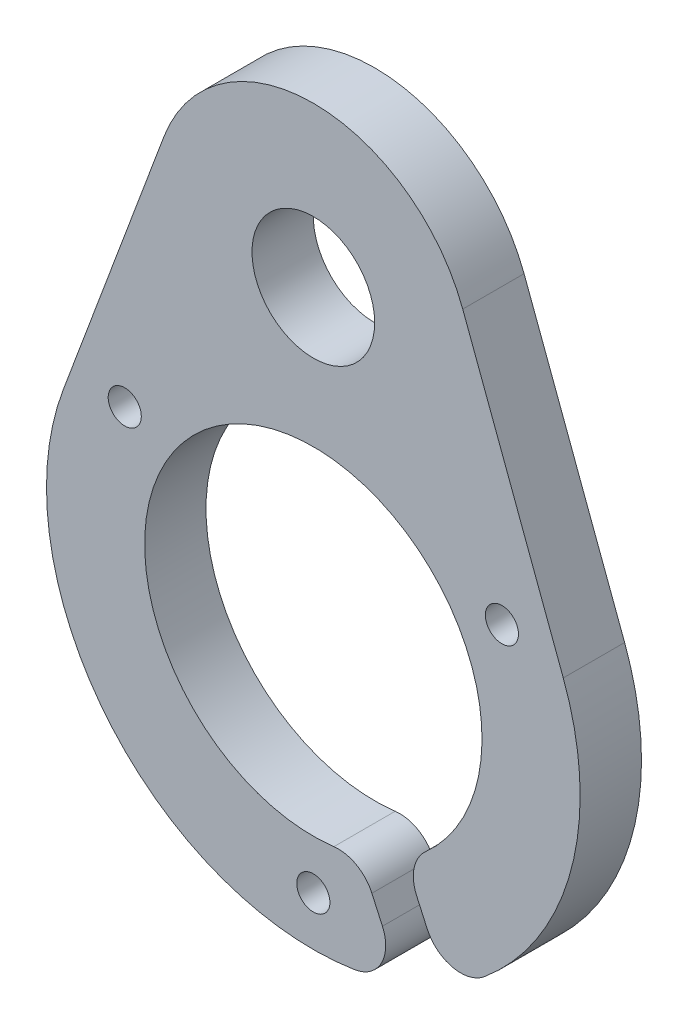
ISO-10303-21;
HEADER;
FILE_DESCRIPTION(('STEP AP214'),'2;1');
FILE_NAME('part.step','',(''),(''),'','','');
FILE_SCHEMA(('AUTOMOTIVE_DESIGN { 1 0 10303 214 1 1 1 1 }'));
ENDSEC;
DATA;
#1=APPLICATION_CONTEXT('core data for automotive mechanical design processes');
#2=APPLICATION_PROTOCOL_DEFINITION('international standard','automotive_design',2000,#1);
#3=PRODUCT_CONTEXT('',#1,'mechanical');
#4=PRODUCT('Part','Part','',(#3));
#5=PRODUCT_RELATED_PRODUCT_CATEGORY('part','',(#4));
#6=PRODUCT_DEFINITION_FORMATION('','',#4);
#7=PRODUCT_DEFINITION_CONTEXT('part definition',#1,'design');
#8=PRODUCT_DEFINITION('design','',#6,#7);
#9=PRODUCT_DEFINITION_SHAPE('','',#8);
#10=(LENGTH_UNIT() NAMED_UNIT(*) SI_UNIT(.MILLI.,.METRE.));
#11=(NAMED_UNIT(*) PLANE_ANGLE_UNIT() SI_UNIT($,.RADIAN.));
#12=(NAMED_UNIT(*) SI_UNIT($,.STERADIAN.) SOLID_ANGLE_UNIT());
#13=UNCERTAINTY_MEASURE_WITH_UNIT(LENGTH_MEASURE(1.E-05),#10,'distance_accuracy_value','');
#14=(GEOMETRIC_REPRESENTATION_CONTEXT(3) GLOBAL_UNCERTAINTY_ASSIGNED_CONTEXT((#13)) GLOBAL_UNIT_ASSIGNED_CONTEXT((#10,
#11,#12)) REPRESENTATION_CONTEXT('',''));
#15=CARTESIAN_POINT('',(0.,0.,0.));
#16=DIRECTION('',(0.,0.,1.));
#17=DIRECTION('',(1.,0.,0.));
#18=AXIS2_PLACEMENT_3D('',#15,#16,#17);
#19=CARTESIAN_POINT('',(0.,0.,5.));
#20=DIRECTION('',(0.,0.,-1.));
#21=DIRECTION('',(-1.,0.,0.));
#22=AXIS2_PLACEMENT_3D('',#19,#20,#21);
#23=PLANE('',#22);
#24=DIRECTION('',(0.412539939152384,-0.910939514240186,0.));
#25=VECTOR('',#24,1.);
#26=CARTESIAN_POINT('',(7.43397659385823,-11.5671298082959,5.));
#27=LINE('',#26,#25);
#28=CARTESIAN_POINT('',(8.41687544862555,-13.7374927727852,5.));
#29=VERTEX_POINT('',#28);
#30=CARTESIAN_POINT('',(9.27690492252214,-15.6365448567925,5.));
#31=VERTEX_POINT('',#30);
#32=EDGE_CURVE('E135',#29,#31,#27,.T.);
#33=ORIENTED_EDGE('',*,*,#32,.T.);
#34=CARTESIAN_POINT('',(12.0097234652427,-14.3989250393354,5.));
#35=DIRECTION('',(0.,0.,-1.));
#36=DIRECTION('',(-1.,0.,0.));
#37=AXIS2_PLACEMENT_3D('',#34,#35,#36);
#38=CIRCLE('',#37,3.);
#39=CARTESIAN_POINT('',(13.9312792196815,-16.702753045629,5.));
#40=VERTEX_POINT('',#39);
#41=EDGE_CURVE('E131',#31,#40,#38,.F.);
#42=ORIENTED_EDGE('',*,*,#41,.T.);
#43=CARTESIAN_POINT('',(0.,0.,5.));
#44=DIRECTION('',(0.,0.,1.));
#45=DIRECTION('',(1.,0.,0.));
#46=AXIS2_PLACEMENT_3D('',#43,#44,#45);
#47=CIRCLE('',#46,21.75);
#48=CARTESIAN_POINT('',(20.3743059697748,7.6125,5.));
#49=VERTEX_POINT('',#48);
#50=EDGE_CURVE('E123',#40,#49,#47,.T.);
#51=ORIENTED_EDGE('',*,*,#50,.T.);
#52=DIRECTION('',(-0.35,0.93674969975976,0.));
#53=VECTOR('',#52,1.);
#54=CARTESIAN_POINT('',(12.1777460968769,29.55,5.));
#55=LINE('',#54,#53);
#56=CARTESIAN_POINT('',(12.1777460968769,29.55,5.));
#57=VERTEX_POINT('',#56);
#58=EDGE_CURVE('E128',#49,#57,#55,.T.);
#59=ORIENTED_EDGE('',*,*,#58,.T.);
#60=CARTESIAN_POINT('',(0.,25.,5.));
#61=DIRECTION('',(0.,0.,1.));
#62=DIRECTION('',(-1.,0.,0.));
#63=AXIS2_PLACEMENT_3D('',#60,#61,#62);
#64=CIRCLE('',#63,13.);
#65=CARTESIAN_POINT('',(-12.1777460968769,29.55,5.));
#66=VERTEX_POINT('',#65);
#67=EDGE_CURVE('E150',#57,#66,#64,.T.);
#68=ORIENTED_EDGE('',*,*,#67,.T.);
#69=DIRECTION('',(-0.35,-0.93674969975976,0.));
#70=VECTOR('',#69,1.);
#71=CARTESIAN_POINT('',(-20.3743059697748,7.6125,5.));
#72=LINE('',#71,#70);
#73=CARTESIAN_POINT('',(-20.3743059697747,7.61249999999996,5.));
#74=VERTEX_POINT('',#73);
#75=EDGE_CURVE('E152',#66,#74,#72,.T.);
#76=ORIENTED_EDGE('',*,*,#75,.T.);
#77=CARTESIAN_POINT('',(2.0122792321331E-13,0.,5.));
#78=DIRECTION('',(0.,0.,1.));
#79=DIRECTION('',(1.,0.,0.));
#80=AXIS2_PLACEMENT_3D('',#77,#78,#79);
#81=CIRCLE('',#80,21.7500000000001);
#82=CARTESIAN_POINT('',(3.36438085449537,-21.4882163397968,5.));
#83=VERTEX_POINT('',#82);
#84=EDGE_CURVE('E157',#74,#83,#81,.T.);
#85=ORIENTED_EDGE('',*,*,#84,.T.);
#86=CARTESIAN_POINT('',(2.90032832284087,-18.5243244308593,5.));
#87=DIRECTION('',(0.,0.,-1.));
#88=DIRECTION('',(-1.,0.,0.));
#89=AXIS2_PLACEMENT_3D('',#86,#87,#88);
#90=CIRCLE('',#89,3.);
#91=CARTESIAN_POINT('',(5.63314686556143,-17.2867046134021,5.));
#92=VERTEX_POINT('',#91);
#93=EDGE_CURVE('E57',#83,#92,#90,.F.);
#94=ORIENTED_EDGE('',*,*,#93,.T.);
#95=DIRECTION('',(-0.412539939152385,0.910939514240186,0.));
#96=VECTOR('',#95,1.);
#97=CARTESIAN_POINT('',(3.79021853689748,-13.2172895649055,5.));
#98=LINE('',#97,#96);
#99=CARTESIAN_POINT('',(4.7731173916648,-15.3876525293947,5.));
#100=VERTEX_POINT('',#99);
#101=EDGE_CURVE('E159',#92,#100,#98,.T.);
#102=ORIENTED_EDGE('',*,*,#101,.T.);
#103=CARTESIAN_POINT('',(2.04029884894424,-16.6252723468519,5.));
#104=DIRECTION('',(0.,0.,-1.));
#105=DIRECTION('',(-1.,0.,0.));
#106=AXIS2_PLACEMENT_3D('',#103,#104,#105);
#107=CIRCLE('',#106,3.);
#108=CARTESIAN_POINT('',(1.67487218943184,-13.6476116280127,5.));
#109=VERTEX_POINT('',#108);
#110=EDGE_CURVE('E205',#100,#109,#107,.F.);
#111=ORIENTED_EDGE('',*,*,#110,.T.);
#112=CARTESIAN_POINT('',(0.,0.,5.));
#113=DIRECTION('',(0.,0.,-1.));
#114=DIRECTION('',(-1.,0.,0.));
#115=AXIS2_PLACEMENT_3D('',#112,#113,#114);
#116=CIRCLE('',#115,13.75);
#117=CARTESIAN_POINT('',(9.15273387349307,-10.2610897394484,5.));
#118=VERTEX_POINT('',#117);
#119=EDGE_CURVE('E181',#109,#118,#116,.T.);
#120=ORIENTED_EDGE('',*,*,#119,.T.);
#121=CARTESIAN_POINT('',(11.1496939913461,-12.499872955328,5.));
#122=DIRECTION('',(0.,0.,-1.));
#123=DIRECTION('',(-1.,0.,0.));
#124=AXIS2_PLACEMENT_3D('',#121,#122,#123);
#125=CIRCLE('',#124,3.);
#126=EDGE_CURVE('E203',#118,#29,#125,.F.);
#127=ORIENTED_EDGE('',*,*,#126,.T.);
#128=EDGE_LOOP('',(#33,#42,#51,#59,#68,#76,#85,#94,#102,#111,#120,#127));
#129=FACE_BOUND('',#128,.T.);
#130=CARTESIAN_POINT('',(0.,25.,5.));
#131=DIRECTION('',(0.,0.,1.));
#132=DIRECTION('',(1.,0.,0.));
#133=AXIS2_PLACEMENT_3D('',#130,#131,#132);
#134=CIRCLE('',#133,5.);
#135=CARTESIAN_POINT('',(5.,25.,5.));
#136=VERTEX_POINT('',#135);
#137=EDGE_CURVE('E166',#136,#136,#134,.T.);
#138=ORIENTED_EDGE('',*,*,#137,.F.);
#139=EDGE_LOOP('',(#138));
#140=FACE_BOUND('',#139,.T.);
#141=CARTESIAN_POINT('',(0.,-17.75,5.));
#142=DIRECTION('',(0.,0.,1.));
#143=DIRECTION('',(1.,0.,0.));
#144=AXIS2_PLACEMENT_3D('',#141,#142,#143);
#145=CIRCLE('',#144,1.35);
#146=CARTESIAN_POINT('',(1.35,-17.75,5.));
#147=VERTEX_POINT('',#146);
#148=EDGE_CURVE('E239',#147,#147,#145,.T.);
#149=ORIENTED_EDGE('',*,*,#148,.F.);
#150=EDGE_LOOP('',(#149));
#151=FACE_BOUND('',#150,.T.);
#152=CARTESIAN_POINT('',(15.3719509171737,8.87500000000007,5.));
#153=DIRECTION('',(0.,0.,1.));
#154=DIRECTION('',(1.,0.,0.));
#155=AXIS2_PLACEMENT_3D('',#152,#153,#154);
#156=CIRCLE('',#155,1.35);
#157=CARTESIAN_POINT('',(16.7219509171737,8.87500000000007,5.));
#158=VERTEX_POINT('',#157);
#159=EDGE_CURVE('E245',#158,#158,#156,.T.);
#160=ORIENTED_EDGE('',*,*,#159,.F.);
#161=EDGE_LOOP('',(#160));
#162=FACE_BOUND('',#161,.T.);
#163=CARTESIAN_POINT('',(-15.3719509171737,8.87500000000007,5.));
#164=DIRECTION('',(0.,0.,1.));
#165=DIRECTION('',(1.,0.,0.));
#166=AXIS2_PLACEMENT_3D('',#163,#164,#165);
#167=CIRCLE('',#166,1.35);
#168=CARTESIAN_POINT('',(-14.0219509171737,8.87500000000007,5.));
#169=VERTEX_POINT('',#168);
#170=EDGE_CURVE('E251',#169,#169,#167,.T.);
#171=ORIENTED_EDGE('',*,*,#170,.F.);
#172=EDGE_LOOP('',(#171));
#173=FACE_BOUND('',#172,.T.);
#174=ADVANCED_FACE('F36',(#129,#140,#151,#162,#173),#23,.F.);
#175=CARTESIAN_POINT('',(0.,0.,0.));
#176=DIRECTION('',(0.,0.,-1.));
#177=DIRECTION('',(-1.,0.,0.));
#178=AXIS2_PLACEMENT_3D('',#175,#176,#177);
#179=PLANE('',#178);
#180=CARTESIAN_POINT('',(15.3719509171737,8.87500000000007,0.));
#181=DIRECTION('',(0.,0.,1.));
#182=DIRECTION('',(1.,0.,0.));
#183=AXIS2_PLACEMENT_3D('',#180,#181,#182);
#184=CIRCLE('',#183,1.35);
#185=CARTESIAN_POINT('',(16.7219509171737,8.87500000000007,0.));
#186=VERTEX_POINT('',#185);
#187=EDGE_CURVE('E248',#186,#186,#184,.T.);
#188=ORIENTED_EDGE('',*,*,#187,.T.);
#189=EDGE_LOOP('',(#188));
#190=FACE_BOUND('',#189,.T.);
#191=CARTESIAN_POINT('',(0.,25.,0.));
#192=DIRECTION('',(0.,0.,1.));
#193=DIRECTION('',(1.,0.,0.));
#194=AXIS2_PLACEMENT_3D('',#191,#192,#193);
#195=CIRCLE('',#194,5.);
#196=CARTESIAN_POINT('',(5.,25.,0.));
#197=VERTEX_POINT('',#196);
#198=EDGE_CURVE('E236',#197,#197,#195,.T.);
#199=ORIENTED_EDGE('',*,*,#198,.T.);
#200=EDGE_LOOP('',(#199));
#201=FACE_BOUND('',#200,.T.);
#202=CARTESIAN_POINT('',(0.,0.,0.));
#203=DIRECTION('',(0.,0.,1.));
#204=DIRECTION('',(1.,0.,0.));
#205=AXIS2_PLACEMENT_3D('',#202,#203,#204);
#206=CIRCLE('',#205,21.75);
#207=CARTESIAN_POINT('',(13.9312792196815,-16.702753045629,0.));
#208=VERTEX_POINT('',#207);
#209=CARTESIAN_POINT('',(20.3743059697748,7.6125,0.));
#210=VERTEX_POINT('',#209);
#211=EDGE_CURVE('E141',#208,#210,#206,.T.);
#212=ORIENTED_EDGE('',*,*,#211,.F.);
#213=CARTESIAN_POINT('',(12.0097234652427,-14.3989250393354,0.));
#214=DIRECTION('',(0.,0.,-1.));
#215=DIRECTION('',(-1.,0.,0.));
#216=AXIS2_PLACEMENT_3D('',#213,#214,#215);
#217=CIRCLE('',#216,3.);
#218=CARTESIAN_POINT('',(9.27690492252214,-15.6365448567925,0.));
#219=VERTEX_POINT('',#218);
#220=EDGE_CURVE('E195',#208,#219,#217,.T.);
#221=ORIENTED_EDGE('',*,*,#220,.T.);
#222=DIRECTION('',(0.412539939152384,-0.910939514240186,0.));
#223=VECTOR('',#222,1.);
#224=CARTESIAN_POINT('',(7.43397659385823,-11.5671298082959,0.));
#225=LINE('',#224,#223);
#226=CARTESIAN_POINT('',(8.41687544862555,-13.7374927727852,0.));
#227=VERTEX_POINT('',#226);
#228=EDGE_CURVE('E165',#227,#219,#225,.T.);
#229=ORIENTED_EDGE('',*,*,#228,.F.);
#230=CARTESIAN_POINT('',(11.1496939913461,-12.499872955328,0.));
#231=DIRECTION('',(0.,0.,-1.));
#232=DIRECTION('',(-1.,0.,0.));
#233=AXIS2_PLACEMENT_3D('',#230,#231,#232);
#234=CIRCLE('',#233,3.);
#235=CARTESIAN_POINT('',(9.15273387349307,-10.2610897394484,0.));
#236=VERTEX_POINT('',#235);
#237=EDGE_CURVE('E191',#227,#236,#234,.T.);
#238=ORIENTED_EDGE('',*,*,#237,.T.);
#239=CARTESIAN_POINT('',(0.,0.,0.));
#240=DIRECTION('',(0.,0.,-1.));
#241=DIRECTION('',(-1.,0.,0.));
#242=AXIS2_PLACEMENT_3D('',#239,#240,#241);
#243=CIRCLE('',#242,13.75);
#244=CARTESIAN_POINT('',(1.67487218943184,-13.6476116280127,0.));
#245=VERTEX_POINT('',#244);
#246=EDGE_CURVE('E162',#245,#236,#243,.T.);
#247=ORIENTED_EDGE('',*,*,#246,.F.);
#248=CARTESIAN_POINT('',(2.04029884894424,-16.6252723468519,0.));
#249=DIRECTION('',(0.,0.,-1.));
#250=DIRECTION('',(-1.,0.,0.));
#251=AXIS2_PLACEMENT_3D('',#248,#249,#250);
#252=CIRCLE('',#251,3.);
#253=CARTESIAN_POINT('',(4.7731173916648,-15.3876525293947,0.));
#254=VERTEX_POINT('',#253);
#255=EDGE_CURVE('E193',#245,#254,#252,.T.);
#256=ORIENTED_EDGE('',*,*,#255,.T.);
#257=DIRECTION('',(-0.412539939152385,0.910939514240186,0.));
#258=VECTOR('',#257,1.);
#259=CARTESIAN_POINT('',(3.79021853689748,-13.2172895649055,0.));
#260=LINE('',#259,#258);
#261=CARTESIAN_POINT('',(5.63314686556143,-17.2867046134021,0.));
#262=VERTEX_POINT('',#261);
#263=EDGE_CURVE('E179',#262,#254,#260,.T.);
#264=ORIENTED_EDGE('',*,*,#263,.F.);
#265=CARTESIAN_POINT('',(2.90032832284087,-18.5243244308593,0.));
#266=DIRECTION('',(0.,0.,-1.));
#267=DIRECTION('',(-1.,0.,0.));
#268=AXIS2_PLACEMENT_3D('',#265,#266,#267);
#269=CIRCLE('',#268,3.);
#270=CARTESIAN_POINT('',(3.36438085449537,-21.4882163397968,0.));
#271=VERTEX_POINT('',#270);
#272=EDGE_CURVE('E189',#262,#271,#269,.T.);
#273=ORIENTED_EDGE('',*,*,#272,.T.);
#274=CARTESIAN_POINT('',(2.0122792321331E-13,0.,0.));
#275=DIRECTION('',(0.,0.,1.));
#276=DIRECTION('',(1.,0.,0.));
#277=AXIS2_PLACEMENT_3D('',#274,#275,#276);
#278=CIRCLE('',#277,21.7500000000001);
#279=CARTESIAN_POINT('',(-20.3743059697747,7.61249999999996,0.));
#280=VERTEX_POINT('',#279);
#281=EDGE_CURVE('E176',#280,#271,#278,.T.);
#282=ORIENTED_EDGE('',*,*,#281,.F.);
#283=DIRECTION('',(-0.35,-0.93674969975976,0.));
#284=VECTOR('',#283,1.);
#285=CARTESIAN_POINT('',(-20.3743059697748,7.6125,0.));
#286=LINE('',#285,#284);
#287=CARTESIAN_POINT('',(-12.1777460968769,29.55,0.));
#288=VERTEX_POINT('',#287);
#289=EDGE_CURVE('E174',#288,#280,#286,.T.);
#290=ORIENTED_EDGE('',*,*,#289,.F.);
#291=CARTESIAN_POINT('',(0.,25.,0.));
#292=DIRECTION('',(0.,0.,1.));
#293=DIRECTION('',(-1.,0.,0.));
#294=AXIS2_PLACEMENT_3D('',#291,#292,#293);
#295=CIRCLE('',#294,13.);
#296=CARTESIAN_POINT('',(12.1777460968769,29.55,0.));
#297=VERTEX_POINT('',#296);
#298=EDGE_CURVE('E172',#297,#288,#295,.T.);
#299=ORIENTED_EDGE('',*,*,#298,.F.);
#300=DIRECTION('',(-0.35,0.93674969975976,0.));
#301=VECTOR('',#300,1.);
#302=CARTESIAN_POINT('',(12.1777460968769,29.55,0.));
#303=LINE('',#302,#301);
#304=EDGE_CURVE('E170',#210,#297,#303,.T.);
#305=ORIENTED_EDGE('',*,*,#304,.F.);
#306=EDGE_LOOP('',(#212,#221,#229,#238,#247,#256,#264,#273,#282,#290,#299,#305));
#307=FACE_BOUND('',#306,.T.);
#308=CARTESIAN_POINT('',(0.,-17.75,0.));
#309=DIRECTION('',(0.,0.,1.));
#310=DIRECTION('',(1.,0.,0.));
#311=AXIS2_PLACEMENT_3D('',#308,#309,#310);
#312=CIRCLE('',#311,1.35);
#313=CARTESIAN_POINT('',(1.35,-17.75,0.));
#314=VERTEX_POINT('',#313);
#315=EDGE_CURVE('E242',#314,#314,#312,.T.);
#316=ORIENTED_EDGE('',*,*,#315,.T.);
#317=EDGE_LOOP('',(#316));
#318=FACE_BOUND('',#317,.T.);
#319=CARTESIAN_POINT('',(-15.3719509171737,8.87500000000007,0.));
#320=DIRECTION('',(0.,0.,1.));
#321=DIRECTION('',(1.,0.,0.));
#322=AXIS2_PLACEMENT_3D('',#319,#320,#321);
#323=CIRCLE('',#322,1.35);
#324=CARTESIAN_POINT('',(-14.0219509171737,8.87500000000007,0.));
#325=VERTEX_POINT('',#324);
#326=EDGE_CURVE('E254',#325,#325,#323,.T.);
#327=ORIENTED_EDGE('',*,*,#326,.T.);
#328=EDGE_LOOP('',(#327));
#329=FACE_BOUND('',#328,.T.);
#330=ADVANCED_FACE('F220',(#190,#201,#307,#318,#329),#179,.T.);
#331=CARTESIAN_POINT('',(0.,0.,5.));
#332=DIRECTION('',(0.,0.,-1.));
#333=DIRECTION('',(-1.,0.,0.));
#334=AXIS2_PLACEMENT_3D('',#331,#332,#333);
#335=CYLINDRICAL_SURFACE('',#334,13.75);
#336=ORIENTED_EDGE('',*,*,#119,.F.);
#337=DIRECTION('',(0.,0.,-1.));
#338=VECTOR('',#337,1.);
#339=CARTESIAN_POINT('',(1.67487218943184,-13.6476116280127,5.));
#340=LINE('',#339,#338);
#341=EDGE_CURVE('E210',#109,#245,#340,.T.);
#342=ORIENTED_EDGE('',*,*,#341,.T.);
#343=ORIENTED_EDGE('',*,*,#246,.T.);
#344=DIRECTION('',(0.,0.,-1.));
#345=VECTOR('',#344,1.);
#346=CARTESIAN_POINT('',(9.15273387349307,-10.2610897394484,5.));
#347=LINE('',#346,#345);
#348=EDGE_CURVE('E208',#236,#118,#347,.F.);
#349=ORIENTED_EDGE('',*,*,#348,.T.);
#350=EDGE_LOOP('',(#336,#342,#343,#349));
#351=FACE_BOUND('',#350,.T.);
#352=ADVANCED_FACE('F230',(#351),#335,.F.);
#353=CARTESIAN_POINT('',(7.43397659385823,-11.5671298082959,5.));
#354=DIRECTION('',(0.910939514240187,0.412539939152384,0.));
#355=DIRECTION('',(-0.412539939152384,0.910939514240187,0.));
#356=AXIS2_PLACEMENT_3D('',#353,#354,#355);
#357=PLANE('',#356);
#358=ORIENTED_EDGE('',*,*,#228,.T.);
#359=DIRECTION('',(0.,0.,-1.));
#360=VECTOR('',#359,1.);
#361=CARTESIAN_POINT('',(9.27690492252214,-15.6365448567925,5.));
#362=LINE('',#361,#360);
#363=EDGE_CURVE('E200',#219,#31,#362,.F.);
#364=ORIENTED_EDGE('',*,*,#363,.T.);
#365=ORIENTED_EDGE('',*,*,#32,.F.);
#366=DIRECTION('',(0.,0.,-1.));
#367=VECTOR('',#366,1.);
#368=CARTESIAN_POINT('',(8.41687544862555,-13.7374927727852,5.));
#369=LINE('',#368,#367);
#370=EDGE_CURVE('E197',#29,#227,#369,.T.);
#371=ORIENTED_EDGE('',*,*,#370,.T.);
#372=EDGE_LOOP('',(#358,#364,#365,#371));
#373=FACE_BOUND('',#372,.T.);
#374=ADVANCED_FACE('F292',(#373),#357,.F.);
#375=CARTESIAN_POINT('',(0.,0.,5.));
#376=DIRECTION('',(0.,0.,-1.));
#377=DIRECTION('',(-1.,0.,0.));
#378=AXIS2_PLACEMENT_3D('',#375,#376,#377);
#379=CYLINDRICAL_SURFACE('',#378,21.75);
#380=ORIENTED_EDGE('',*,*,#50,.F.);
#381=DIRECTION('',(0.,0.,-1.));
#382=VECTOR('',#381,1.);
#383=CARTESIAN_POINT('',(13.9312792196815,-16.702753045629,5.));
#384=LINE('',#383,#382);
#385=EDGE_CURVE('E144',#40,#208,#384,.T.);
#386=ORIENTED_EDGE('',*,*,#385,.T.);
#387=ORIENTED_EDGE('',*,*,#211,.T.);
#388=DIRECTION('',(0.,0.,-1.));
#389=VECTOR('',#388,1.);
#390=CARTESIAN_POINT('',(20.3743059697748,7.6125,5.));
#391=LINE('',#390,#389);
#392=EDGE_CURVE('E138',#49,#210,#391,.T.);
#393=ORIENTED_EDGE('',*,*,#392,.F.);
#394=EDGE_LOOP('',(#380,#386,#387,#393));
#395=FACE_BOUND('',#394,.T.);
#396=ADVANCED_FACE('F139',(#395),#379,.T.);
#397=CARTESIAN_POINT('',(12.1777460968769,29.55,5.));
#398=DIRECTION('',(-0.93674969975976,-0.35,0.));
#399=DIRECTION('',(0.35,-0.93674969975976,0.));
#400=AXIS2_PLACEMENT_3D('',#397,#398,#399);
#401=PLANE('',#400);
#402=ORIENTED_EDGE('',*,*,#304,.T.);
#403=DIRECTION('',(0.,0.,-1.));
#404=VECTOR('',#403,1.);
#405=CARTESIAN_POINT('',(12.1777460968769,29.55,5.));
#406=LINE('',#405,#404);
#407=EDGE_CURVE('E145',#57,#297,#406,.T.);
#408=ORIENTED_EDGE('',*,*,#407,.F.);
#409=ORIENTED_EDGE('',*,*,#58,.F.);
#410=ORIENTED_EDGE('',*,*,#392,.T.);
#411=EDGE_LOOP('',(#402,#408,#409,#410));
#412=FACE_BOUND('',#411,.T.);
#413=ADVANCED_FACE('F147',(#412),#401,.F.);
#414=CARTESIAN_POINT('',(0.,25.,5.));
#415=DIRECTION('',(0.,0.,-1.));
#416=DIRECTION('',(-1.,0.,0.));
#417=AXIS2_PLACEMENT_3D('',#414,#415,#416);
#418=CYLINDRICAL_SURFACE('',#417,13.);
#419=ORIENTED_EDGE('',*,*,#298,.T.);
#420=DIRECTION('',(0.,0.,-1.));
#421=VECTOR('',#420,1.);
#422=CARTESIAN_POINT('',(-12.1777460968769,29.55,5.));
#423=LINE('',#422,#421);
#424=EDGE_CURVE('E184',#66,#288,#423,.T.);
#425=ORIENTED_EDGE('',*,*,#424,.F.);
#426=ORIENTED_EDGE('',*,*,#67,.F.);
#427=ORIENTED_EDGE('',*,*,#407,.T.);
#428=EDGE_LOOP('',(#419,#425,#426,#427));
#429=FACE_BOUND('',#428,.T.);
#430=ADVANCED_FACE('F283',(#429),#418,.T.);
#431=CARTESIAN_POINT('',(-20.3743059697748,7.6125,5.));
#432=DIRECTION('',(0.93674969975976,-0.35,0.));
#433=DIRECTION('',(0.35,0.93674969975976,0.));
#434=AXIS2_PLACEMENT_3D('',#431,#432,#433);
#435=PLANE('',#434);
#436=ORIENTED_EDGE('',*,*,#289,.T.);
#437=DIRECTION('',(0.,0.,-1.));
#438=VECTOR('',#437,1.);
#439=CARTESIAN_POINT('',(-20.3743059697747,7.61249999999996,5.));
#440=LINE('',#439,#438);
#441=EDGE_CURVE('E161',#74,#280,#440,.T.);
#442=ORIENTED_EDGE('',*,*,#441,.F.);
#443=ORIENTED_EDGE('',*,*,#75,.F.);
#444=ORIENTED_EDGE('',*,*,#424,.T.);
#445=EDGE_LOOP('',(#436,#442,#443,#444));
#446=FACE_BOUND('',#445,.T.);
#447=ADVANCED_FACE('F279',(#446),#435,.F.);
#448=CARTESIAN_POINT('',(2.0122792321331E-13,0.,5.));
#449=DIRECTION('',(0.,0.,-1.));
#450=DIRECTION('',(-1.,0.,0.));
#451=AXIS2_PLACEMENT_3D('',#448,#449,#450);
#452=CYLINDRICAL_SURFACE('',#451,21.7500000000001);
#453=ORIENTED_EDGE('',*,*,#281,.T.);
#454=DIRECTION('',(0.,0.,-1.));
#455=VECTOR('',#454,1.);
#456=CARTESIAN_POINT('',(3.36438085449537,-21.4882163397968,5.));
#457=LINE('',#456,#455);
#458=EDGE_CURVE('E11',#271,#83,#457,.F.);
#459=ORIENTED_EDGE('',*,*,#458,.T.);
#460=ORIENTED_EDGE('',*,*,#84,.F.);
#461=ORIENTED_EDGE('',*,*,#441,.T.);
#462=EDGE_LOOP('',(#453,#459,#460,#461));
#463=FACE_BOUND('',#462,.T.);
#464=ADVANCED_FACE('F276',(#463),#452,.T.);
#465=CARTESIAN_POINT('',(3.79021853689748,-13.2172895649055,5.));
#466=DIRECTION('',(-0.910939514240187,-0.412539939152385,0.));
#467=DIRECTION('',(0.412539939152385,-0.910939514240187,0.));
#468=AXIS2_PLACEMENT_3D('',#465,#466,#467);
#469=PLANE('',#468);
#470=ORIENTED_EDGE('',*,*,#263,.T.);
#471=DIRECTION('',(0.,0.,-1.));
#472=VECTOR('',#471,1.);
#473=CARTESIAN_POINT('',(4.7731173916648,-15.3876525293947,5.));
#474=LINE('',#473,#472);
#475=EDGE_CURVE('E44',#254,#100,#474,.F.);
#476=ORIENTED_EDGE('',*,*,#475,.T.);
#477=ORIENTED_EDGE('',*,*,#101,.F.);
#478=DIRECTION('',(0.,0.,-1.));
#479=VECTOR('',#478,1.);
#480=CARTESIAN_POINT('',(5.63314686556143,-17.2867046134021,5.));
#481=LINE('',#480,#479);
#482=EDGE_CURVE('E213',#92,#262,#481,.T.);
#483=ORIENTED_EDGE('',*,*,#482,.T.);
#484=EDGE_LOOP('',(#470,#476,#477,#483));
#485=FACE_BOUND('',#484,.T.);
#486=ADVANCED_FACE('F217',(#485),#469,.F.);
#487=CARTESIAN_POINT('',(0.,25.,5.));
#488=DIRECTION('',(0.,0.,-1.));
#489=DIRECTION('',(-1.,0.,0.));
#490=AXIS2_PLACEMENT_3D('',#487,#488,#489);
#491=CYLINDRICAL_SURFACE('',#490,5.);
#492=ORIENTED_EDGE('',*,*,#137,.T.);
#493=EDGE_LOOP('',(#492));
#494=FACE_BOUND('',#493,.T.);
#495=ORIENTED_EDGE('',*,*,#198,.F.);
#496=EDGE_LOOP('',(#495));
#497=FACE_BOUND('',#496,.T.);
#498=ADVANCED_FACE('F271',(#494,#497),#491,.F.);
#499=CARTESIAN_POINT('',(0.,-17.75,5.));
#500=DIRECTION('',(0.,0.,-1.));
#501=DIRECTION('',(-1.,0.,0.));
#502=AXIS2_PLACEMENT_3D('',#499,#500,#501);
#503=CYLINDRICAL_SURFACE('',#502,1.35);
#504=ORIENTED_EDGE('',*,*,#148,.T.);
#505=EDGE_LOOP('',(#504));
#506=FACE_BOUND('',#505,.T.);
#507=ORIENTED_EDGE('',*,*,#315,.F.);
#508=EDGE_LOOP('',(#507));
#509=FACE_BOUND('',#508,.T.);
#510=ADVANCED_FACE('F400',(#506,#509),#503,.F.);
#511=CARTESIAN_POINT('',(15.3719509171737,8.87500000000007,5.));
#512=DIRECTION('',(0.,0.,-1.));
#513=DIRECTION('',(-1.,0.,0.));
#514=AXIS2_PLACEMENT_3D('',#511,#512,#513);
#515=CYLINDRICAL_SURFACE('',#514,1.35);
#516=ORIENTED_EDGE('',*,*,#159,.T.);
#517=EDGE_LOOP('',(#516));
#518=FACE_BOUND('',#517,.T.);
#519=ORIENTED_EDGE('',*,*,#187,.F.);
#520=EDGE_LOOP('',(#519));
#521=FACE_BOUND('',#520,.T.);
#522=ADVANCED_FACE('F391',(#518,#521),#515,.F.);
#523=CARTESIAN_POINT('',(-15.3719509171737,8.87500000000007,5.));
#524=DIRECTION('',(0.,0.,-1.));
#525=DIRECTION('',(-1.,0.,0.));
#526=AXIS2_PLACEMENT_3D('',#523,#524,#525);
#527=CYLINDRICAL_SURFACE('',#526,1.35);
#528=ORIENTED_EDGE('',*,*,#170,.T.);
#529=EDGE_LOOP('',(#528));
#530=FACE_BOUND('',#529,.T.);
#531=ORIENTED_EDGE('',*,*,#326,.F.);
#532=EDGE_LOOP('',(#531));
#533=FACE_BOUND('',#532,.T.);
#534=ADVANCED_FACE('F260',(#530,#533),#527,.F.);
#535=CARTESIAN_POINT('',(12.0097234652427,-14.3989250393354,5.));
#536=DIRECTION('',(0.,0.,-1.));
#537=DIRECTION('',(-1.,0.,0.));
#538=AXIS2_PLACEMENT_3D('',#535,#536,#537);
#539=CYLINDRICAL_SURFACE('',#538,3.);
#540=ORIENTED_EDGE('',*,*,#41,.F.);
#541=ORIENTED_EDGE('',*,*,#363,.F.);
#542=ORIENTED_EDGE('',*,*,#220,.F.);
#543=ORIENTED_EDGE('',*,*,#385,.F.);
#544=EDGE_LOOP('',(#540,#541,#542,#543));
#545=FACE_BOUND('',#544,.T.);
#546=ADVANCED_FACE('F298',(#545),#539,.T.);
#547=CARTESIAN_POINT('',(2.04029884894424,-16.6252723468519,5.));
#548=DIRECTION('',(0.,0.,-1.));
#549=DIRECTION('',(-1.,0.,0.));
#550=AXIS2_PLACEMENT_3D('',#547,#548,#549);
#551=CYLINDRICAL_SURFACE('',#550,3.);
#552=ORIENTED_EDGE('',*,*,#110,.F.);
#553=ORIENTED_EDGE('',*,*,#475,.F.);
#554=ORIENTED_EDGE('',*,*,#255,.F.);
#555=ORIENTED_EDGE('',*,*,#341,.F.);
#556=EDGE_LOOP('',(#552,#553,#554,#555));
#557=FACE_BOUND('',#556,.T.);
#558=ADVANCED_FACE('F227',(#557),#551,.T.);
#559=CARTESIAN_POINT('',(11.1496939913461,-12.499872955328,5.));
#560=DIRECTION('',(0.,0.,-1.));
#561=DIRECTION('',(-1.,0.,0.));
#562=AXIS2_PLACEMENT_3D('',#559,#560,#561);
#563=CYLINDRICAL_SURFACE('',#562,3.);
#564=ORIENTED_EDGE('',*,*,#126,.F.);
#565=ORIENTED_EDGE('',*,*,#348,.F.);
#566=ORIENTED_EDGE('',*,*,#237,.F.);
#567=ORIENTED_EDGE('',*,*,#370,.F.);
#568=EDGE_LOOP('',(#564,#565,#566,#567));
#569=FACE_BOUND('',#568,.T.);
#570=ADVANCED_FACE('F303',(#569),#563,.T.);
#571=CARTESIAN_POINT('',(2.90032832284087,-18.5243244308593,5.));
#572=DIRECTION('',(0.,0.,-1.));
#573=DIRECTION('',(-1.,0.,0.));
#574=AXIS2_PLACEMENT_3D('',#571,#572,#573);
#575=CYLINDRICAL_SURFACE('',#574,3.);
#576=ORIENTED_EDGE('',*,*,#93,.F.);
#577=ORIENTED_EDGE('',*,*,#458,.F.);
#578=ORIENTED_EDGE('',*,*,#272,.F.);
#579=ORIENTED_EDGE('',*,*,#482,.F.);
#580=EDGE_LOOP('',(#576,#577,#578,#579));
#581=FACE_BOUND('',#580,.T.);
#582=ADVANCED_FACE('F38',(#581),#575,.T.);
#583=CLOSED_SHELL('',(#174,#330,#352,#374,#396,#413,#430,#447,#464,#486,#498,#510,#522,#534,
#546,#558,#570,#582));
#584=MANIFOLD_SOLID_BREP('B2',#583);
#585=ADVANCED_BREP_SHAPE_REPRESENTATION('',(#18,#584),#14);
#586=SHAPE_DEFINITION_REPRESENTATION(#9,#585);
ENDSEC;
END-ISO-10303-21;
